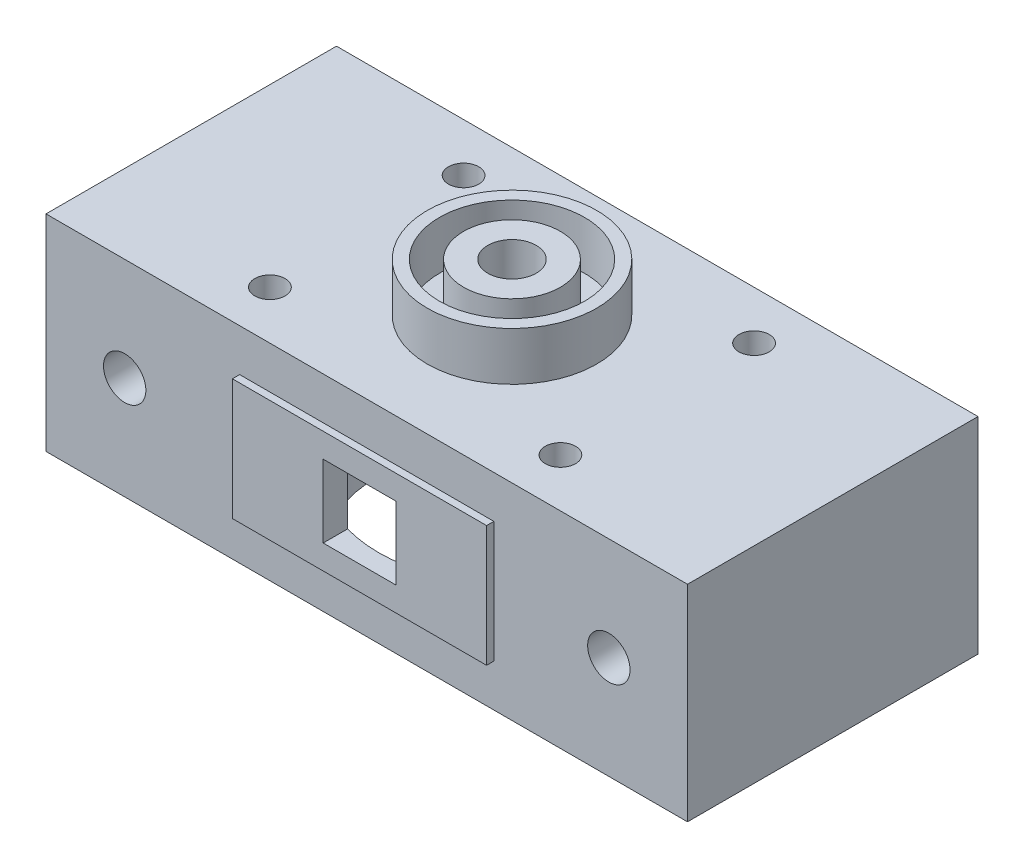
ISO-10303-21;
HEADER;
FILE_DESCRIPTION(('STEP AP214'),'2;1');
FILE_NAME('part.step','',(''),(''),'','','');
FILE_SCHEMA(('AUTOMOTIVE_DESIGN { 1 0 10303 214 1 1 1 1 }'));
ENDSEC;
DATA;
#1=APPLICATION_CONTEXT('core data for automotive mechanical design processes');
#2=APPLICATION_PROTOCOL_DEFINITION('international standard','automotive_design',2000,#1);
#3=PRODUCT_CONTEXT('',#1,'mechanical');
#4=PRODUCT('Part','Part','',(#3));
#5=PRODUCT_RELATED_PRODUCT_CATEGORY('part','',(#4));
#6=PRODUCT_DEFINITION_FORMATION('','',#4);
#7=PRODUCT_DEFINITION_CONTEXT('part definition',#1,'design');
#8=PRODUCT_DEFINITION('design','',#6,#7);
#9=PRODUCT_DEFINITION_SHAPE('','',#8);
#10=(LENGTH_UNIT() NAMED_UNIT(*) SI_UNIT(.MILLI.,.METRE.));
#11=(NAMED_UNIT(*) PLANE_ANGLE_UNIT() SI_UNIT($,.RADIAN.));
#12=(NAMED_UNIT(*) SI_UNIT($,.STERADIAN.) SOLID_ANGLE_UNIT());
#13=UNCERTAINTY_MEASURE_WITH_UNIT(LENGTH_MEASURE(1.E-05),#10,'distance_accuracy_value','');
#14=(GEOMETRIC_REPRESENTATION_CONTEXT(3) GLOBAL_UNCERTAINTY_ASSIGNED_CONTEXT((#13)) GLOBAL_UNIT_ASSIGNED_CONTEXT((#10,
#11,#12)) REPRESENTATION_CONTEXT('',''));
#15=CARTESIAN_POINT('',(0.,0.,0.));
#16=DIRECTION('',(0.,0.,1.));
#17=DIRECTION('',(1.,0.,0.));
#18=AXIS2_PLACEMENT_3D('',#15,#16,#17);
#19=CARTESIAN_POINT('',(26.5,0.,-12.));
#20=DIRECTION('',(0.,1.,0.));
#21=DIRECTION('',(0.,0.,1.));
#22=AXIS2_PLACEMENT_3D('',#19,#20,#21);
#23=PLANE('',#22);
#24=CARTESIAN_POINT('',(0.,0.,0.));
#25=DIRECTION('',(0.,1.,0.));
#26=DIRECTION('',(0.,0.,1.));
#27=AXIS2_PLACEMENT_3D('',#24,#25,#26);
#28=CIRCLE('',#27,4.);
#29=CARTESIAN_POINT('',(0.,0.,4.));
#30=VERTEX_POINT('',#29);
#31=EDGE_CURVE('E228',#30,#30,#28,.T.);
#32=ORIENTED_EDGE('',*,*,#31,.F.);
#33=EDGE_LOOP('',(#32));
#34=FACE_BOUND('',#33,.T.);
#35=CARTESIAN_POINT('',(0.,0.,0.));
#36=DIRECTION('',(0.,1.,0.));
#37=DIRECTION('',(0.,0.,1.));
#38=AXIS2_PLACEMENT_3D('',#35,#36,#37);
#39=CIRCLE('',#38,6.);
#40=CARTESIAN_POINT('',(0.,0.,6.));
#41=VERTEX_POINT('',#40);
#42=EDGE_CURVE('E12',#41,#41,#39,.F.);
#43=ORIENTED_EDGE('',*,*,#42,.F.);
#44=EDGE_LOOP('',(#43));
#45=FACE_BOUND('',#44,.T.);
#46=ADVANCED_FACE('F46',(#34,#45),#23,.T.);
#47=CARTESIAN_POINT('',(-3.00000000000078,-5.49999999999998,-10.8));
#48=DIRECTION('',(-1.,0.,0.));
#49=DIRECTION('',(0.,-1.,0.));
#50=AXIS2_PLACEMENT_3D('',#47,#48,#49);
#51=PLANE('',#50);
#52=DIRECTION('',(0.,0.,-1.));
#53=VECTOR('',#52,1.);
#54=CARTESIAN_POINT('',(-3.00000000000078,-5.49999999999998,-10.8));
#55=LINE('',#54,#53);
#56=CARTESIAN_POINT('',(-3.00000000000079,-5.49999999999998,-10.5830052442581));
#57=VERTEX_POINT('',#56);
#58=CARTESIAN_POINT('',(-3.00000000000078,-5.49999999999998,-12.6));
#59=VERTEX_POINT('',#58);
#60=EDGE_CURVE('E69',#57,#59,#55,.T.);
#61=ORIENTED_EDGE('',*,*,#60,.F.);
#62=DIRECTION('',(0.,1.,0.));
#63=VECTOR('',#62,1.);
#64=CARTESIAN_POINT('',(-3.00000000000079,-48.1126983722081,-10.5830052442581));
#65=LINE('',#64,#63);
#66=CARTESIAN_POINT('',(-3.00000000000078,-11.5,-10.5830052442581));
#67=VERTEX_POINT('',#66);
#68=EDGE_CURVE('E397',#57,#67,#65,.F.);
#69=ORIENTED_EDGE('',*,*,#68,.T.);
#70=DIRECTION('',(0.,0.,-1.));
#71=VECTOR('',#70,1.);
#72=CARTESIAN_POINT('',(-3.00000000000078,-11.5,-10.8));
#73=LINE('',#72,#71);
#74=CARTESIAN_POINT('',(-3.00000000000078,-11.5,-12.6));
#75=VERTEX_POINT('',#74);
#76=EDGE_CURVE('E347',#67,#75,#73,.T.);
#77=ORIENTED_EDGE('',*,*,#76,.T.);
#78=DIRECTION('',(0.,1.,0.));
#79=VECTOR('',#78,1.);
#80=CARTESIAN_POINT('',(-3.00000000000078,-11.5,-12.6));
#81=LINE('',#80,#79);
#82=EDGE_CURVE('E313',#75,#59,#81,.T.);
#83=ORIENTED_EDGE('',*,*,#82,.T.);
#84=EDGE_LOOP('',(#61,#69,#77,#83));
#85=FACE_BOUND('',#84,.T.);
#86=ADVANCED_FACE('F443',(#85),#51,.F.);
#87=CARTESIAN_POINT('',(2.99999999999922,-11.5,-10.8));
#88=DIRECTION('',(0.,-1.,0.));
#89=DIRECTION('',(0.,0.,-1.));
#90=AXIS2_PLACEMENT_3D('',#87,#88,#89);
#91=PLANE('',#90);
#92=ORIENTED_EDGE('',*,*,#76,.F.);
#93=CARTESIAN_POINT('',(0.,-11.5,0.));
#94=DIRECTION('',(0.,-1.,0.));
#95=DIRECTION('',(0.,0.,-1.));
#96=AXIS2_PLACEMENT_3D('',#93,#94,#95);
#97=CIRCLE('',#96,11.);
#98=CARTESIAN_POINT('',(2.99999999999922,-11.5,-10.5830052442586));
#99=VERTEX_POINT('',#98);
#100=EDGE_CURVE('E400',#67,#99,#97,.T.);
#101=ORIENTED_EDGE('',*,*,#100,.T.);
#102=DIRECTION('',(0.,0.,-1.));
#103=VECTOR('',#102,1.);
#104=CARTESIAN_POINT('',(2.99999999999922,-11.5,-10.8));
#105=LINE('',#104,#103);
#106=CARTESIAN_POINT('',(2.99999999999922,-11.5,-12.6));
#107=VERTEX_POINT('',#106);
#108=EDGE_CURVE('E350',#99,#107,#105,.T.);
#109=ORIENTED_EDGE('',*,*,#108,.T.);
#110=DIRECTION('',(-1.,0.,0.));
#111=VECTOR('',#110,1.);
#112=CARTESIAN_POINT('',(2.99999999999922,-11.5,-12.6));
#113=LINE('',#112,#111);
#114=EDGE_CURVE('E310',#107,#75,#113,.T.);
#115=ORIENTED_EDGE('',*,*,#114,.T.);
#116=EDGE_LOOP('',(#92,#101,#109,#115));
#117=FACE_BOUND('',#116,.T.);
#118=ADVANCED_FACE('F448',(#117),#91,.F.);
#119=CARTESIAN_POINT('',(2.99999999999922,-5.49999999999998,-10.8));
#120=DIRECTION('',(1.,0.,0.));
#121=DIRECTION('',(0.,0.,-1.));
#122=AXIS2_PLACEMENT_3D('',#119,#120,#121);
#123=PLANE('',#122);
#124=ORIENTED_EDGE('',*,*,#108,.F.);
#125=DIRECTION('',(0.,1.,0.));
#126=VECTOR('',#125,1.);
#127=CARTESIAN_POINT('',(2.99999999999922,-48.1126983722081,-10.5830052442586));
#128=LINE('',#127,#126);
#129=CARTESIAN_POINT('',(2.99999999999922,-5.49999999999998,-10.5830052442586));
#130=VERTEX_POINT('',#129);
#131=EDGE_CURVE('E403',#99,#130,#128,.T.);
#132=ORIENTED_EDGE('',*,*,#131,.T.);
#133=DIRECTION('',(0.,0.,-1.));
#134=VECTOR('',#133,1.);
#135=CARTESIAN_POINT('',(2.99999999999922,-5.49999999999998,-10.8));
#136=LINE('',#135,#134);
#137=CARTESIAN_POINT('',(2.99999999999922,-5.49999999999998,-12.6));
#138=VERTEX_POINT('',#137);
#139=EDGE_CURVE('E352',#130,#138,#136,.T.);
#140=ORIENTED_EDGE('',*,*,#139,.T.);
#141=DIRECTION('',(0.,-1.,0.));
#142=VECTOR('',#141,1.);
#143=CARTESIAN_POINT('',(2.99999999999922,-5.49999999999998,-12.6));
#144=LINE('',#143,#142);
#145=EDGE_CURVE('E302',#138,#107,#144,.T.);
#146=ORIENTED_EDGE('',*,*,#145,.T.);
#147=EDGE_LOOP('',(#124,#132,#140,#146));
#148=FACE_BOUND('',#147,.T.);
#149=ADVANCED_FACE('F517',(#148),#123,.F.);
#150=CARTESIAN_POINT('',(2.99999999999922,-5.49999999999998,-10.8));
#151=DIRECTION('',(0.,1.,0.));
#152=DIRECTION('',(0.,0.,1.));
#153=AXIS2_PLACEMENT_3D('',#150,#151,#152);
#154=PLANE('',#153);
#155=ORIENTED_EDGE('',*,*,#139,.F.);
#156=CARTESIAN_POINT('',(0.,-5.49999999999998,0.));
#157=DIRECTION('',(0.,1.,0.));
#158=DIRECTION('',(0.,0.,1.));
#159=AXIS2_PLACEMENT_3D('',#156,#157,#158);
#160=CIRCLE('',#159,11.);
#161=EDGE_CURVE('E407',#130,#57,#160,.T.);
#162=ORIENTED_EDGE('',*,*,#161,.T.);
#163=ORIENTED_EDGE('',*,*,#60,.T.);
#164=DIRECTION('',(1.,0.,0.));
#165=VECTOR('',#164,1.);
#166=CARTESIAN_POINT('',(-3.00000000000078,-5.49999999999998,-12.6));
#167=LINE('',#166,#165);
#168=EDGE_CURVE('E315',#59,#138,#167,.T.);
#169=ORIENTED_EDGE('',*,*,#168,.T.);
#170=EDGE_LOOP('',(#155,#162,#163,#169));
#171=FACE_BOUND('',#170,.T.);
#172=ADVANCED_FACE('F514',(#171),#154,.F.);
#173=CARTESIAN_POINT('',(-3.00000000000078,-5.49999999999998,10.8));
#174=DIRECTION('',(1.,0.,0.));
#175=DIRECTION('',(0.,1.,0.));
#176=AXIS2_PLACEMENT_3D('',#173,#174,#175);
#177=PLANE('',#176);
#178=DIRECTION('',(0.,0.,1.));
#179=VECTOR('',#178,1.);
#180=CARTESIAN_POINT('',(-3.00000000000078,-11.5,10.8));
#181=LINE('',#180,#179);
#182=CARTESIAN_POINT('',(-3.00000000000079,-11.5,10.5830052442581));
#183=VERTEX_POINT('',#182);
#184=CARTESIAN_POINT('',(-3.00000000000078,-11.5,12.6));
#185=VERTEX_POINT('',#184);
#186=EDGE_CURVE('E61',#183,#185,#181,.T.);
#187=ORIENTED_EDGE('',*,*,#186,.F.);
#188=DIRECTION('',(0.,1.,0.));
#189=VECTOR('',#188,1.);
#190=CARTESIAN_POINT('',(-3.00000000000079,-48.1126983722081,10.5830052442581));
#191=LINE('',#190,#189);
#192=CARTESIAN_POINT('',(-3.00000000000078,-5.49999999999998,10.5830052442581));
#193=VERTEX_POINT('',#192);
#194=EDGE_CURVE('E409',#183,#193,#191,.T.);
#195=ORIENTED_EDGE('',*,*,#194,.T.);
#196=DIRECTION('',(0.,0.,1.));
#197=VECTOR('',#196,1.);
#198=CARTESIAN_POINT('',(-3.00000000000078,-5.49999999999998,10.8));
#199=LINE('',#198,#197);
#200=CARTESIAN_POINT('',(-3.00000000000078,-5.49999999999998,12.6));
#201=VERTEX_POINT('',#200);
#202=EDGE_CURVE('E300',#193,#201,#199,.T.);
#203=ORIENTED_EDGE('',*,*,#202,.T.);
#204=DIRECTION('',(0.,1.,0.));
#205=VECTOR('',#204,1.);
#206=CARTESIAN_POINT('',(-3.00000000000078,-11.5,12.6));
#207=LINE('',#206,#205);
#208=EDGE_CURVE('E261',#185,#201,#207,.T.);
#209=ORIENTED_EDGE('',*,*,#208,.F.);
#210=EDGE_LOOP('',(#187,#195,#203,#209));
#211=FACE_BOUND('',#210,.T.);
#212=ADVANCED_FACE('F424',(#211),#177,.T.);
#213=CARTESIAN_POINT('',(2.99999999999922,-5.49999999999998,10.8));
#214=DIRECTION('',(0.,-1.,0.));
#215=DIRECTION('',(0.,0.,-1.));
#216=AXIS2_PLACEMENT_3D('',#213,#214,#215);
#217=PLANE('',#216);
#218=ORIENTED_EDGE('',*,*,#202,.F.);
#219=CARTESIAN_POINT('',(2.99999999999922,-5.49999999999998,10.5830052442586));
#220=VERTEX_POINT('',#219);
#221=EDGE_CURVE('E54',#193,#220,#160,.T.);
#222=ORIENTED_EDGE('',*,*,#221,.T.);
#223=DIRECTION('',(0.,0.,1.));
#224=VECTOR('',#223,1.);
#225=CARTESIAN_POINT('',(2.99999999999922,-5.49999999999998,10.8));
#226=LINE('',#225,#224);
#227=CARTESIAN_POINT('',(2.99999999999922,-5.49999999999998,12.6));
#228=VERTEX_POINT('',#227);
#229=EDGE_CURVE('E303',#220,#228,#226,.T.);
#230=ORIENTED_EDGE('',*,*,#229,.T.);
#231=DIRECTION('',(1.,0.,0.));
#232=VECTOR('',#231,1.);
#233=CARTESIAN_POINT('',(-3.00000000000078,-5.49999999999998,12.6));
#234=LINE('',#233,#232);
#235=EDGE_CURVE('E258',#201,#228,#234,.T.);
#236=ORIENTED_EDGE('',*,*,#235,.F.);
#237=EDGE_LOOP('',(#218,#222,#230,#236));
#238=FACE_BOUND('',#237,.T.);
#239=ADVANCED_FACE('F427',(#238),#217,.T.);
#240=CARTESIAN_POINT('',(2.99999999999922,-5.49999999999998,10.8));
#241=DIRECTION('',(-1.,0.,0.));
#242=DIRECTION('',(0.,0.,1.));
#243=AXIS2_PLACEMENT_3D('',#240,#241,#242);
#244=PLANE('',#243);
#245=ORIENTED_EDGE('',*,*,#229,.F.);
#246=DIRECTION('',(0.,1.,0.));
#247=VECTOR('',#246,1.);
#248=CARTESIAN_POINT('',(2.99999999999922,-48.1126983722081,10.5830052442586));
#249=LINE('',#248,#247);
#250=CARTESIAN_POINT('',(2.99999999999922,-11.5,10.5830052442586));
#251=VERTEX_POINT('',#250);
#252=EDGE_CURVE('E410',#220,#251,#249,.F.);
#253=ORIENTED_EDGE('',*,*,#252,.T.);
#254=DIRECTION('',(0.,0.,1.));
#255=VECTOR('',#254,1.);
#256=CARTESIAN_POINT('',(2.99999999999922,-11.5,10.8));
#257=LINE('',#256,#255);
#258=CARTESIAN_POINT('',(2.99999999999922,-11.5,12.6));
#259=VERTEX_POINT('',#258);
#260=EDGE_CURVE('E305',#251,#259,#257,.T.);
#261=ORIENTED_EDGE('',*,*,#260,.T.);
#262=DIRECTION('',(0.,-1.,0.));
#263=VECTOR('',#262,1.);
#264=CARTESIAN_POINT('',(2.99999999999922,-5.49999999999998,12.6));
#265=LINE('',#264,#263);
#266=EDGE_CURVE('E255',#228,#259,#265,.T.);
#267=ORIENTED_EDGE('',*,*,#266,.F.);
#268=EDGE_LOOP('',(#245,#253,#261,#267));
#269=FACE_BOUND('',#268,.T.);
#270=ADVANCED_FACE('F432',(#269),#244,.T.);
#271=CARTESIAN_POINT('',(2.99999999999922,-11.5,10.8));
#272=DIRECTION('',(0.,1.,0.));
#273=DIRECTION('',(0.,0.,1.));
#274=AXIS2_PLACEMENT_3D('',#271,#272,#273);
#275=PLANE('',#274);
#276=ORIENTED_EDGE('',*,*,#260,.F.);
#277=EDGE_CURVE('E404',#251,#183,#97,.T.);
#278=ORIENTED_EDGE('',*,*,#277,.T.);
#279=ORIENTED_EDGE('',*,*,#186,.T.);
#280=DIRECTION('',(-1.,0.,0.));
#281=VECTOR('',#280,1.);
#282=CARTESIAN_POINT('',(2.99999999999922,-11.5,12.6));
#283=LINE('',#282,#281);
#284=EDGE_CURVE('E264',#259,#185,#283,.T.);
#285=ORIENTED_EDGE('',*,*,#284,.F.);
#286=EDGE_LOOP('',(#276,#278,#279,#285));
#287=FACE_BOUND('',#286,.T.);
#288=ADVANCED_FACE('F418',(#287),#275,.T.);
#289=CARTESIAN_POINT('',(0.,0.,-12.));
#290=DIRECTION('',(0.,0.,-1.));
#291=DIRECTION('',(-1.,0.,0.));
#292=AXIS2_PLACEMENT_3D('',#289,#290,#291);
#293=PLANE('',#292);
#294=CARTESIAN_POINT('',(-20.,-8.5,-12.));
#295=DIRECTION('',(0.,0.,-1.));
#296=DIRECTION('',(-1.,0.,0.));
#297=AXIS2_PLACEMENT_3D('',#294,#295,#296);
#298=CIRCLE('',#297,1.75);
#299=CARTESIAN_POINT('',(-21.75,-8.5,-12.));
#300=VERTEX_POINT('',#299);
#301=EDGE_CURVE('E360',#300,#300,#298,.T.);
#302=ORIENTED_EDGE('',*,*,#301,.F.);
#303=EDGE_LOOP('',(#302));
#304=FACE_BOUND('',#303,.T.);
#305=CARTESIAN_POINT('',(20.,-8.5,-12.));
#306=DIRECTION('',(0.,0.,1.));
#307=DIRECTION('',(1.,0.,0.));
#308=AXIS2_PLACEMENT_3D('',#305,#306,#307);
#309=CIRCLE('',#308,1.75);
#310=CARTESIAN_POINT('',(21.75,-8.5,-12.));
#311=VERTEX_POINT('',#310);
#312=EDGE_CURVE('E383',#311,#311,#309,.T.);
#313=ORIENTED_EDGE('',*,*,#312,.T.);
#314=EDGE_LOOP('',(#313));
#315=FACE_BOUND('',#314,.T.);
#316=DIRECTION('',(1.,0.,0.));
#317=VECTOR('',#316,1.);
#318=CARTESIAN_POINT('',(26.5,-17.,-12.));
#319=LINE('',#318,#317);
#320=CARTESIAN_POINT('',(-26.5,-17.,-12.));
#321=VERTEX_POINT('',#320);
#322=CARTESIAN_POINT('',(26.5,-17.,-12.));
#323=VERTEX_POINT('',#322);
#324=EDGE_CURVE('E388',#321,#323,#319,.T.);
#325=ORIENTED_EDGE('',*,*,#324,.F.);
#326=DIRECTION('',(0.,1.,0.));
#327=VECTOR('',#326,1.);
#328=CARTESIAN_POINT('',(-26.5,0.,-12.));
#329=LINE('',#328,#327);
#330=CARTESIAN_POINT('',(-26.5,0.,-12.));
#331=VERTEX_POINT('',#330);
#332=EDGE_CURVE('E363',#321,#331,#329,.T.);
#333=ORIENTED_EDGE('',*,*,#332,.T.);
#334=DIRECTION('',(-1.,0.,0.));
#335=VECTOR('',#334,1.);
#336=CARTESIAN_POINT('',(26.5,0.,-12.));
#337=LINE('',#336,#335);
#338=CARTESIAN_POINT('',(26.5,0.,-12.));
#339=VERTEX_POINT('',#338);
#340=EDGE_CURVE('E386',#339,#331,#337,.T.);
#341=ORIENTED_EDGE('',*,*,#340,.F.);
#342=DIRECTION('',(0.,1.,0.));
#343=VECTOR('',#342,1.);
#344=CARTESIAN_POINT('',(26.5,0.,-12.));
#345=LINE('',#344,#343);
#346=EDGE_CURVE('E391',#323,#339,#345,.T.);
#347=ORIENTED_EDGE('',*,*,#346,.F.);
#348=EDGE_LOOP('',(#325,#333,#341,#347));
#349=FACE_BOUND('',#348,.T.);
#350=DIRECTION('',(1.,0.,0.));
#351=VECTOR('',#350,1.);
#352=CARTESIAN_POINT('',(10.4999999999992,-3.49999999999998,-12.));
#353=LINE('',#352,#351);
#354=CARTESIAN_POINT('',(-10.5000000000008,-3.49999999999998,-12.));
#355=VERTEX_POINT('',#354);
#356=CARTESIAN_POINT('',(10.4999999999992,-3.49999999999998,-12.));
#357=VERTEX_POINT('',#356);
#358=EDGE_CURVE('E332',#355,#357,#353,.T.);
#359=ORIENTED_EDGE('',*,*,#358,.F.);
#360=DIRECTION('',(0.,1.,0.));
#361=VECTOR('',#360,1.);
#362=CARTESIAN_POINT('',(-10.5000000000008,-3.49999999999998,-12.));
#363=LINE('',#362,#361);
#364=CARTESIAN_POINT('',(-10.5000000000008,-13.5,-12.));
#365=VERTEX_POINT('',#364);
#366=EDGE_CURVE('E318',#365,#355,#363,.T.);
#367=ORIENTED_EDGE('',*,*,#366,.F.);
#368=DIRECTION('',(-1.,0.,0.));
#369=VECTOR('',#368,1.);
#370=CARTESIAN_POINT('',(10.4999999999992,-13.5,-12.));
#371=LINE('',#370,#369);
#372=CARTESIAN_POINT('',(10.4999999999992,-13.5,-12.));
#373=VERTEX_POINT('',#372);
#374=EDGE_CURVE('E323',#373,#365,#371,.T.);
#375=ORIENTED_EDGE('',*,*,#374,.F.);
#376=DIRECTION('',(0.,-1.,0.));
#377=VECTOR('',#376,1.);
#378=CARTESIAN_POINT('',(10.4999999999992,-3.49999999999998,-12.));
#379=LINE('',#378,#377);
#380=EDGE_CURVE('E334',#357,#373,#379,.T.);
#381=ORIENTED_EDGE('',*,*,#380,.F.);
#382=EDGE_LOOP('',(#359,#367,#375,#381));
#383=FACE_BOUND('',#382,.T.);
#384=ADVANCED_FACE('F439',(#304,#315,#349,#383),#293,.T.);
#385=CARTESIAN_POINT('',(12.,0.,-8.));
#386=DIRECTION('',(0.,1.,0.));
#387=DIRECTION('',(0.,0.,1.));
#388=AXIS2_PLACEMENT_3D('',#385,#386,#387);
#389=CIRCLE('',#388,1.24999999999999);
#390=CARTESIAN_POINT('',(12.,0.,-6.75000000000001));
#391=VERTEX_POINT('',#390);
#392=EDGE_CURVE('E206',#391,#391,#389,.T.);
#393=ORIENTED_EDGE('',*,*,#392,.F.);
#394=EDGE_LOOP('',(#393));
#395=FACE_BOUND('',#394,.T.);
#396=CARTESIAN_POINT('',(12.,0.,8.));
#397=DIRECTION('',(0.,1.,0.));
#398=DIRECTION('',(0.,0.,1.));
#399=AXIS2_PLACEMENT_3D('',#396,#397,#398);
#400=CIRCLE('',#399,1.24999999999999);
#401=CARTESIAN_POINT('',(12.,0.,9.24999999999999));
#402=VERTEX_POINT('',#401);
#403=EDGE_CURVE('E205',#402,#402,#400,.T.);
#404=ORIENTED_EDGE('',*,*,#403,.F.);
#405=EDGE_LOOP('',(#404));
#406=FACE_BOUND('',#405,.T.);
#407=CARTESIAN_POINT('',(-12.,0.,8.));
#408=DIRECTION('',(0.,1.,0.));
#409=DIRECTION('',(0.,0.,1.));
#410=AXIS2_PLACEMENT_3D('',#407,#408,#409);
#411=CIRCLE('',#410,1.24999999999999);
#412=CARTESIAN_POINT('',(-12.,0.,9.24999999999999));
#413=VERTEX_POINT('',#412);
#414=EDGE_CURVE('E216',#413,#413,#411,.T.);
#415=ORIENTED_EDGE('',*,*,#414,.F.);
#416=EDGE_LOOP('',(#415));
#417=FACE_BOUND('',#416,.T.);
#418=CARTESIAN_POINT('',(-12.,0.,-8.));
#419=DIRECTION('',(0.,1.,0.));
#420=DIRECTION('',(0.,0.,1.));
#421=AXIS2_PLACEMENT_3D('',#418,#419,#420);
#422=CIRCLE('',#421,1.24999999999999);
#423=CARTESIAN_POINT('',(-12.,0.,-6.75000000000001));
#424=VERTEX_POINT('',#423);
#425=EDGE_CURVE('E222',#424,#424,#422,.T.);
#426=ORIENTED_EDGE('',*,*,#425,.F.);
#427=EDGE_LOOP('',(#426));
#428=FACE_BOUND('',#427,.T.);
#429=CARTESIAN_POINT('',(0.,0.,0.));
#430=DIRECTION('',(0.,1.,0.));
#431=DIRECTION('',(0.,0.,1.));
#432=AXIS2_PLACEMENT_3D('',#429,#430,#431);
#433=CIRCLE('',#432,7.);
#434=CARTESIAN_POINT('',(0.,0.,7.));
#435=VERTEX_POINT('',#434);
#436=EDGE_CURVE('E235',#435,#435,#433,.T.);
#437=ORIENTED_EDGE('',*,*,#436,.F.);
#438=EDGE_LOOP('',(#437));
#439=FACE_BOUND('',#438,.T.);
#440=ORIENTED_EDGE('',*,*,#340,.T.);
#441=DIRECTION('',(0.,0.,1.));
#442=VECTOR('',#441,1.);
#443=CARTESIAN_POINT('',(-26.5,0.,-12.));
#444=LINE('',#443,#442);
#445=CARTESIAN_POINT('',(-26.5,0.,12.));
#446=VERTEX_POINT('',#445);
#447=EDGE_CURVE('E366',#331,#446,#444,.T.);
#448=ORIENTED_EDGE('',*,*,#447,.T.);
#449=DIRECTION('',(-1.,0.,0.));
#450=VECTOR('',#449,1.);
#451=CARTESIAN_POINT('',(26.5,0.,12.));
#452=LINE('',#451,#450);
#453=CARTESIAN_POINT('',(26.5,0.,12.));
#454=VERTEX_POINT('',#453);
#455=EDGE_CURVE('E375',#454,#446,#452,.T.);
#456=ORIENTED_EDGE('',*,*,#455,.F.);
#457=DIRECTION('',(0.,0.,1.));
#458=VECTOR('',#457,1.);
#459=CARTESIAN_POINT('',(26.5,0.,-12.));
#460=LINE('',#459,#458);
#461=EDGE_CURVE('E395',#339,#454,#460,.T.);
#462=ORIENTED_EDGE('',*,*,#461,.F.);
#463=EDGE_LOOP('',(#440,#448,#456,#462));
#464=FACE_BOUND('',#463,.T.);
#465=ADVANCED_FACE('F48',(#395,#406,#417,#428,#439,#464),#23,.T.);
#466=CARTESIAN_POINT('',(26.5,0.,-12.));
#467=DIRECTION('',(1.,0.,0.));
#468=DIRECTION('',(0.,1.,0.));
#469=AXIS2_PLACEMENT_3D('',#466,#467,#468);
#470=PLANE('',#469);
#471=ORIENTED_EDGE('',*,*,#461,.T.);
#472=DIRECTION('',(0.,1.,0.));
#473=VECTOR('',#472,1.);
#474=CARTESIAN_POINT('',(26.5,0.,12.));
#475=LINE('',#474,#473);
#476=CARTESIAN_POINT('',(26.5,-17.,12.));
#477=VERTEX_POINT('',#476);
#478=EDGE_CURVE('E380',#477,#454,#475,.T.);
#479=ORIENTED_EDGE('',*,*,#478,.F.);
#480=DIRECTION('',(0.,0.,1.));
#481=VECTOR('',#480,1.);
#482=CARTESIAN_POINT('',(26.5,-17.,-12.));
#483=LINE('',#482,#481);
#484=EDGE_CURVE('E394',#323,#477,#483,.T.);
#485=ORIENTED_EDGE('',*,*,#484,.F.);
#486=ORIENTED_EDGE('',*,*,#346,.T.);
#487=EDGE_LOOP('',(#471,#479,#485,#486));
#488=FACE_BOUND('',#487,.T.);
#489=ADVANCED_FACE('F453',(#488),#470,.T.);
#490=CARTESIAN_POINT('',(26.5,-17.,-12.));
#491=DIRECTION('',(0.,-1.,0.));
#492=DIRECTION('',(1.,0.,0.));
#493=AXIS2_PLACEMENT_3D('',#490,#491,#492);
#494=PLANE('',#493);
#495=CARTESIAN_POINT('',(0.,-17.,0.));
#496=DIRECTION('',(0.,-1.,0.));
#497=DIRECTION('',(1.,0.,0.));
#498=AXIS2_PLACEMENT_3D('',#495,#496,#497);
#499=CIRCLE('',#498,11.);
#500=CARTESIAN_POINT('',(11.,-17.,0.));
#501=VERTEX_POINT('',#500);
#502=EDGE_CURVE('E249',#501,#501,#499,.T.);
#503=ORIENTED_EDGE('',*,*,#502,.F.);
#504=EDGE_LOOP('',(#503));
#505=FACE_BOUND('',#504,.T.);
#506=DIRECTION('',(1.,0.,0.));
#507=VECTOR('',#506,1.);
#508=CARTESIAN_POINT('',(26.5,-17.,12.));
#509=LINE('',#508,#507);
#510=CARTESIAN_POINT('',(-26.5,-17.,12.));
#511=VERTEX_POINT('',#510);
#512=EDGE_CURVE('E377',#511,#477,#509,.T.);
#513=ORIENTED_EDGE('',*,*,#512,.F.);
#514=DIRECTION('',(0.,0.,1.));
#515=VECTOR('',#514,1.);
#516=CARTESIAN_POINT('',(-26.5,-17.,-12.));
#517=LINE('',#516,#515);
#518=EDGE_CURVE('E367',#321,#511,#517,.T.);
#519=ORIENTED_EDGE('',*,*,#518,.F.);
#520=ORIENTED_EDGE('',*,*,#324,.T.);
#521=ORIENTED_EDGE('',*,*,#484,.T.);
#522=EDGE_LOOP('',(#513,#519,#520,#521));
#523=FACE_BOUND('',#522,.T.);
#524=ADVANCED_FACE('F459',(#505,#523),#494,.T.);
#525=CARTESIAN_POINT('',(20.,-8.5,-12.));
#526=DIRECTION('',(0.,0.,1.));
#527=DIRECTION('',(1.,0.,0.));
#528=AXIS2_PLACEMENT_3D('',#525,#526,#527);
#529=CYLINDRICAL_SURFACE('',#528,1.75);
#530=ORIENTED_EDGE('',*,*,#312,.F.);
#531=EDGE_LOOP('',(#530));
#532=FACE_BOUND('',#531,.T.);
#533=CARTESIAN_POINT('',(20.,-8.5,12.));
#534=DIRECTION('',(0.,0.,1.));
#535=DIRECTION('',(1.,0.,0.));
#536=AXIS2_PLACEMENT_3D('',#533,#534,#535);
#537=CIRCLE('',#536,1.75);
#538=CARTESIAN_POINT('',(21.75,-8.5,12.));
#539=VERTEX_POINT('',#538);
#540=EDGE_CURVE('E370',#539,#539,#537,.T.);
#541=ORIENTED_EDGE('',*,*,#540,.T.);
#542=EDGE_LOOP('',(#541));
#543=FACE_BOUND('',#542,.T.);
#544=ADVANCED_FACE('F491',(#532,#543),#529,.F.);
#545=CARTESIAN_POINT('',(0.,0.,12.));
#546=DIRECTION('',(0.,0.,-1.));
#547=DIRECTION('',(-1.,0.,0.));
#548=AXIS2_PLACEMENT_3D('',#545,#546,#547);
#549=PLANE('',#548);
#550=DIRECTION('',(-1.,0.,0.));
#551=VECTOR('',#550,1.);
#552=CARTESIAN_POINT('',(10.4999999999992,-13.5,12.));
#553=LINE('',#552,#551);
#554=CARTESIAN_POINT('',(10.4999999999992,-13.5,12.));
#555=VERTEX_POINT('',#554);
#556=CARTESIAN_POINT('',(-10.5000000000008,-13.5,12.));
#557=VERTEX_POINT('',#556);
#558=EDGE_CURVE('E284',#555,#557,#553,.T.);
#559=ORIENTED_EDGE('',*,*,#558,.T.);
#560=DIRECTION('',(0.,1.,0.));
#561=VECTOR('',#560,1.);
#562=CARTESIAN_POINT('',(-10.5000000000008,-3.49999999999998,12.));
#563=LINE('',#562,#561);
#564=CARTESIAN_POINT('',(-10.5000000000008,-3.49999999999998,12.));
#565=VERTEX_POINT('',#564);
#566=EDGE_CURVE('E267',#557,#565,#563,.T.);
#567=ORIENTED_EDGE('',*,*,#566,.T.);
#568=DIRECTION('',(1.,0.,0.));
#569=VECTOR('',#568,1.);
#570=CARTESIAN_POINT('',(10.4999999999992,-3.49999999999998,12.));
#571=LINE('',#570,#569);
#572=CARTESIAN_POINT('',(10.4999999999992,-3.49999999999998,12.));
#573=VERTEX_POINT('',#572);
#574=EDGE_CURVE('E272',#565,#573,#571,.T.);
#575=ORIENTED_EDGE('',*,*,#574,.T.);
#576=DIRECTION('',(0.,-1.,0.));
#577=VECTOR('',#576,1.);
#578=CARTESIAN_POINT('',(10.4999999999992,-3.49999999999998,12.));
#579=LINE('',#578,#577);
#580=EDGE_CURVE('E287',#573,#555,#579,.T.);
#581=ORIENTED_EDGE('',*,*,#580,.T.);
#582=EDGE_LOOP('',(#559,#567,#575,#581));
#583=FACE_BOUND('',#582,.T.);
#584=DIRECTION('',(0.,1.,0.));
#585=VECTOR('',#584,1.);
#586=CARTESIAN_POINT('',(-26.5,0.,12.));
#587=LINE('',#586,#585);
#588=EDGE_CURVE('E357',#511,#446,#587,.T.);
#589=ORIENTED_EDGE('',*,*,#588,.F.);
#590=ORIENTED_EDGE('',*,*,#512,.T.);
#591=ORIENTED_EDGE('',*,*,#478,.T.);
#592=ORIENTED_EDGE('',*,*,#455,.T.);
#593=EDGE_LOOP('',(#589,#590,#591,#592));
#594=FACE_BOUND('',#593,.T.);
#595=ORIENTED_EDGE('',*,*,#540,.F.);
#596=EDGE_LOOP('',(#595));
#597=FACE_BOUND('',#596,.T.);
#598=CARTESIAN_POINT('',(-20.,-8.5,12.));
#599=DIRECTION('',(0.,0.,-1.));
#600=DIRECTION('',(-1.,0.,0.));
#601=AXIS2_PLACEMENT_3D('',#598,#599,#600);
#602=CIRCLE('',#601,1.75);
#603=CARTESIAN_POINT('',(-21.75,-8.5,12.));
#604=VERTEX_POINT('',#603);
#605=EDGE_CURVE('E349',#604,#604,#602,.T.);
#606=ORIENTED_EDGE('',*,*,#605,.T.);
#607=EDGE_LOOP('',(#606));
#608=FACE_BOUND('',#607,.T.);
#609=ADVANCED_FACE('F486',(#583,#594,#597,#608),#549,.F.);
#610=CARTESIAN_POINT('',(-26.5,0.,-12.));
#611=DIRECTION('',(1.,0.,0.));
#612=DIRECTION('',(0.,1.,0.));
#613=AXIS2_PLACEMENT_3D('',#610,#611,#612);
#614=PLANE('',#613);
#615=ORIENTED_EDGE('',*,*,#518,.T.);
#616=ORIENTED_EDGE('',*,*,#588,.T.);
#617=ORIENTED_EDGE('',*,*,#447,.F.);
#618=ORIENTED_EDGE('',*,*,#332,.F.);
#619=EDGE_LOOP('',(#615,#616,#617,#618));
#620=FACE_BOUND('',#619,.T.);
#621=ADVANCED_FACE('F483',(#620),#614,.F.);
#622=CARTESIAN_POINT('',(-20.,-8.5,-12.));
#623=DIRECTION('',(0.,0.,1.));
#624=DIRECTION('',(1.,0.,0.));
#625=AXIS2_PLACEMENT_3D('',#622,#623,#624);
#626=CYLINDRICAL_SURFACE('',#625,1.75);
#627=ORIENTED_EDGE('',*,*,#301,.T.);
#628=EDGE_LOOP('',(#627));
#629=FACE_BOUND('',#628,.T.);
#630=ORIENTED_EDGE('',*,*,#605,.F.);
#631=EDGE_LOOP('',(#630));
#632=FACE_BOUND('',#631,.T.);
#633=ADVANCED_FACE('F505',(#629,#632),#626,.F.);
#634=CARTESIAN_POINT('',(0.,-17.,0.));
#635=DIRECTION('',(0.,1.,0.));
#636=DIRECTION('',(0.,0.,1.));
#637=AXIS2_PLACEMENT_3D('',#634,#635,#636);
#638=CYLINDRICAL_SURFACE('',#637,2.);
#639=CARTESIAN_POINT('',(0.,-2.7,0.));
#640=DIRECTION('',(0.,-1.,0.));
#641=DIRECTION('',(0.,0.,-1.));
#642=AXIS2_PLACEMENT_3D('',#639,#640,#641);
#643=CIRCLE('',#642,2.);
#644=CARTESIAN_POINT('',(0.,-2.7,-2.));
#645=VERTEX_POINT('',#644);
#646=EDGE_CURVE('E252',#645,#645,#643,.F.);
#647=ORIENTED_EDGE('',*,*,#646,.F.);
#648=EDGE_LOOP('',(#647));
#649=FACE_BOUND('',#648,.T.);
#650=CARTESIAN_POINT('',(0.,4.,0.));
#651=DIRECTION('',(0.,1.,0.));
#652=DIRECTION('',(0.,0.,1.));
#653=AXIS2_PLACEMENT_3D('',#650,#651,#652);
#654=CIRCLE('',#653,2.);
#655=CARTESIAN_POINT('',(0.,4.,2.));
#656=VERTEX_POINT('',#655);
#657=EDGE_CURVE('E229',#656,#656,#654,.F.);
#658=ORIENTED_EDGE('',*,*,#657,.F.);
#659=EDGE_LOOP('',(#658));
#660=FACE_BOUND('',#659,.T.);
#661=ADVANCED_FACE('F508',(#649,#660),#638,.F.);
#662=CARTESIAN_POINT('',(0.,0.,-12.6));
#663=DIRECTION('',(0.,0.,-1.));
#664=DIRECTION('',(-1.,0.,0.));
#665=AXIS2_PLACEMENT_3D('',#662,#663,#664);
#666=PLANE('',#665);
#667=DIRECTION('',(0.,1.,0.));
#668=VECTOR('',#667,1.);
#669=CARTESIAN_POINT('',(-10.5000000000008,-3.49999999999998,-12.6));
#670=LINE('',#669,#668);
#671=CARTESIAN_POINT('',(-10.5000000000008,-13.5,-12.6));
#672=VERTEX_POINT('',#671);
#673=CARTESIAN_POINT('',(-10.5000000000008,-3.49999999999998,-12.6));
#674=VERTEX_POINT('',#673);
#675=EDGE_CURVE('E319',#672,#674,#670,.T.);
#676=ORIENTED_EDGE('',*,*,#675,.T.);
#677=DIRECTION('',(1.,0.,0.));
#678=VECTOR('',#677,1.);
#679=CARTESIAN_POINT('',(10.4999999999992,-3.49999999999998,-12.6));
#680=LINE('',#679,#678);
#681=CARTESIAN_POINT('',(10.4999999999992,-3.49999999999998,-12.6));
#682=VERTEX_POINT('',#681);
#683=EDGE_CURVE('E322',#674,#682,#680,.T.);
#684=ORIENTED_EDGE('',*,*,#683,.T.);
#685=DIRECTION('',(0.,-1.,0.));
#686=VECTOR('',#685,1.);
#687=CARTESIAN_POINT('',(10.4999999999992,-3.49999999999998,-12.6));
#688=LINE('',#687,#686);
#689=CARTESIAN_POINT('',(10.4999999999992,-13.5,-12.6));
#690=VERTEX_POINT('',#689);
#691=EDGE_CURVE('E325',#682,#690,#688,.T.);
#692=ORIENTED_EDGE('',*,*,#691,.T.);
#693=DIRECTION('',(-1.,0.,0.));
#694=VECTOR('',#693,1.);
#695=CARTESIAN_POINT('',(10.4999999999992,-13.5,-12.6));
#696=LINE('',#695,#694);
#697=EDGE_CURVE('E327',#690,#672,#696,.T.);
#698=ORIENTED_EDGE('',*,*,#697,.T.);
#699=EDGE_LOOP('',(#676,#684,#692,#698));
#700=FACE_BOUND('',#699,.T.);
#701=ORIENTED_EDGE('',*,*,#114,.F.);
#702=ORIENTED_EDGE('',*,*,#145,.F.);
#703=ORIENTED_EDGE('',*,*,#168,.F.);
#704=ORIENTED_EDGE('',*,*,#82,.F.);
#705=EDGE_LOOP('',(#701,#702,#703,#704));
#706=FACE_BOUND('',#705,.T.);
#707=ADVANCED_FACE('F511',(#700,#706),#666,.T.);
#708=CARTESIAN_POINT('',(-10.5000000000008,-3.49999999999998,-12.6));
#709=DIRECTION('',(1.,0.,0.));
#710=DIRECTION('',(0.,0.,-1.));
#711=AXIS2_PLACEMENT_3D('',#708,#709,#710);
#712=PLANE('',#711);
#713=ORIENTED_EDGE('',*,*,#366,.T.);
#714=DIRECTION('',(0.,0.,1.));
#715=VECTOR('',#714,1.);
#716=CARTESIAN_POINT('',(-10.5000000000008,-3.49999999999998,-12.6));
#717=LINE('',#716,#715);
#718=EDGE_CURVE('E345',#674,#355,#717,.T.);
#719=ORIENTED_EDGE('',*,*,#718,.F.);
#720=ORIENTED_EDGE('',*,*,#675,.F.);
#721=DIRECTION('',(0.,0.,1.));
#722=VECTOR('',#721,1.);
#723=CARTESIAN_POINT('',(-10.5000000000008,-13.5,-12.6));
#724=LINE('',#723,#722);
#725=EDGE_CURVE('E329',#672,#365,#724,.T.);
#726=ORIENTED_EDGE('',*,*,#725,.T.);
#727=EDGE_LOOP('',(#713,#719,#720,#726));
#728=FACE_BOUND('',#727,.T.);
#729=ADVANCED_FACE('F525',(#728),#712,.F.);
#730=CARTESIAN_POINT('',(10.4999999999992,-3.49999999999998,-12.6));
#731=DIRECTION('',(0.,-1.,0.));
#732=DIRECTION('',(0.,0.,-1.));
#733=AXIS2_PLACEMENT_3D('',#730,#731,#732);
#734=PLANE('',#733);
#735=ORIENTED_EDGE('',*,*,#358,.T.);
#736=DIRECTION('',(0.,0.,1.));
#737=VECTOR('',#736,1.);
#738=CARTESIAN_POINT('',(10.4999999999992,-3.49999999999998,-12.6));
#739=LINE('',#738,#737);
#740=EDGE_CURVE('E342',#682,#357,#739,.T.);
#741=ORIENTED_EDGE('',*,*,#740,.F.);
#742=ORIENTED_EDGE('',*,*,#683,.F.);
#743=ORIENTED_EDGE('',*,*,#718,.T.);
#744=EDGE_LOOP('',(#735,#741,#742,#743));
#745=FACE_BOUND('',#744,.T.);
#746=ADVANCED_FACE('F528',(#745),#734,.F.);
#747=CARTESIAN_POINT('',(10.4999999999992,-3.49999999999998,-12.6));
#748=DIRECTION('',(-1.,0.,0.));
#749=DIRECTION('',(0.,-1.,0.));
#750=AXIS2_PLACEMENT_3D('',#747,#748,#749);
#751=PLANE('',#750);
#752=ORIENTED_EDGE('',*,*,#380,.T.);
#753=DIRECTION('',(0.,0.,1.));
#754=VECTOR('',#753,1.);
#755=CARTESIAN_POINT('',(10.4999999999992,-13.5,-12.6));
#756=LINE('',#755,#754);
#757=EDGE_CURVE('E340',#690,#373,#756,.T.);
#758=ORIENTED_EDGE('',*,*,#757,.F.);
#759=ORIENTED_EDGE('',*,*,#691,.F.);
#760=ORIENTED_EDGE('',*,*,#740,.T.);
#761=EDGE_LOOP('',(#752,#758,#759,#760));
#762=FACE_BOUND('',#761,.T.);
#763=ADVANCED_FACE('F532',(#762),#751,.F.);
#764=CARTESIAN_POINT('',(10.4999999999992,-13.5,-12.6));
#765=DIRECTION('',(0.,1.,0.));
#766=DIRECTION('',(0.,0.,1.));
#767=AXIS2_PLACEMENT_3D('',#764,#765,#766);
#768=PLANE('',#767);
#769=ORIENTED_EDGE('',*,*,#374,.T.);
#770=ORIENTED_EDGE('',*,*,#725,.F.);
#771=ORIENTED_EDGE('',*,*,#697,.F.);
#772=ORIENTED_EDGE('',*,*,#757,.T.);
#773=EDGE_LOOP('',(#769,#770,#771,#772));
#774=FACE_BOUND('',#773,.T.);
#775=ADVANCED_FACE('F536',(#774),#768,.F.);
#776=CARTESIAN_POINT('',(-10.5000000000008,-3.49999999999998,12.6));
#777=DIRECTION('',(-1.,0.,0.));
#778=DIRECTION('',(0.,0.,1.));
#779=AXIS2_PLACEMENT_3D('',#776,#777,#778);
#780=PLANE('',#779);
#781=ORIENTED_EDGE('',*,*,#566,.F.);
#782=DIRECTION('',(0.,0.,-1.));
#783=VECTOR('',#782,1.);
#784=CARTESIAN_POINT('',(-10.5000000000008,-13.5,12.6));
#785=LINE('',#784,#783);
#786=CARTESIAN_POINT('',(-10.5000000000008,-13.5,12.6));
#787=VERTEX_POINT('',#786);
#788=EDGE_CURVE('E298',#787,#557,#785,.T.);
#789=ORIENTED_EDGE('',*,*,#788,.F.);
#790=DIRECTION('',(0.,1.,0.));
#791=VECTOR('',#790,1.);
#792=CARTESIAN_POINT('',(-10.5000000000008,-3.49999999999998,12.6));
#793=LINE('',#792,#791);
#794=CARTESIAN_POINT('',(-10.5000000000008,-3.49999999999998,12.6));
#795=VERTEX_POINT('',#794);
#796=EDGE_CURVE('E268',#787,#795,#793,.T.);
#797=ORIENTED_EDGE('',*,*,#796,.T.);
#798=DIRECTION('',(0.,0.,-1.));
#799=VECTOR('',#798,1.);
#800=CARTESIAN_POINT('',(-10.5000000000008,-3.49999999999998,12.6));
#801=LINE('',#800,#799);
#802=EDGE_CURVE('E281',#795,#565,#801,.T.);
#803=ORIENTED_EDGE('',*,*,#802,.T.);
#804=EDGE_LOOP('',(#781,#789,#797,#803));
#805=FACE_BOUND('',#804,.T.);
#806=ADVANCED_FACE('F540',(#805),#780,.T.);
#807=CARTESIAN_POINT('',(10.4999999999992,-13.5,12.6));
#808=DIRECTION('',(0.,-1.,0.));
#809=DIRECTION('',(0.,0.,-1.));
#810=AXIS2_PLACEMENT_3D('',#807,#808,#809);
#811=PLANE('',#810);
#812=ORIENTED_EDGE('',*,*,#558,.F.);
#813=DIRECTION('',(0.,0.,-1.));
#814=VECTOR('',#813,1.);
#815=CARTESIAN_POINT('',(10.4999999999992,-13.5,12.6));
#816=LINE('',#815,#814);
#817=CARTESIAN_POINT('',(10.4999999999992,-13.5,12.6));
#818=VERTEX_POINT('',#817);
#819=EDGE_CURVE('E296',#818,#555,#816,.T.);
#820=ORIENTED_EDGE('',*,*,#819,.F.);
#821=DIRECTION('',(-1.,0.,0.));
#822=VECTOR('',#821,1.);
#823=CARTESIAN_POINT('',(10.4999999999992,-13.5,12.6));
#824=LINE('',#823,#822);
#825=EDGE_CURVE('E271',#818,#787,#824,.T.);
#826=ORIENTED_EDGE('',*,*,#825,.T.);
#827=ORIENTED_EDGE('',*,*,#788,.T.);
#828=EDGE_LOOP('',(#812,#820,#826,#827));
#829=FACE_BOUND('',#828,.T.);
#830=ADVANCED_FACE('F769',(#829),#811,.T.);
#831=CARTESIAN_POINT('',(10.4999999999992,-3.49999999999998,12.6));
#832=DIRECTION('',(1.,0.,0.));
#833=DIRECTION('',(0.,1.,0.));
#834=AXIS2_PLACEMENT_3D('',#831,#832,#833);
#835=PLANE('',#834);
#836=ORIENTED_EDGE('',*,*,#580,.F.);
#837=DIRECTION('',(0.,0.,-1.));
#838=VECTOR('',#837,1.);
#839=CARTESIAN_POINT('',(10.4999999999992,-3.49999999999998,12.6));
#840=LINE('',#839,#838);
#841=CARTESIAN_POINT('',(10.4999999999992,-3.49999999999998,12.6));
#842=VERTEX_POINT('',#841);
#843=EDGE_CURVE('E293',#842,#573,#840,.T.);
#844=ORIENTED_EDGE('',*,*,#843,.F.);
#845=DIRECTION('',(0.,-1.,0.));
#846=VECTOR('',#845,1.);
#847=CARTESIAN_POINT('',(10.4999999999992,-3.49999999999998,12.6));
#848=LINE('',#847,#846);
#849=EDGE_CURVE('E275',#842,#818,#848,.T.);
#850=ORIENTED_EDGE('',*,*,#849,.T.);
#851=ORIENTED_EDGE('',*,*,#819,.T.);
#852=EDGE_LOOP('',(#836,#844,#850,#851));
#853=FACE_BOUND('',#852,.T.);
#854=ADVANCED_FACE('F765',(#853),#835,.T.);
#855=CARTESIAN_POINT('',(10.4999999999992,-3.49999999999998,12.6));
#856=DIRECTION('',(0.,1.,0.));
#857=DIRECTION('',(0.,0.,1.));
#858=AXIS2_PLACEMENT_3D('',#855,#856,#857);
#859=PLANE('',#858);
#860=ORIENTED_EDGE('',*,*,#574,.F.);
#861=ORIENTED_EDGE('',*,*,#802,.F.);
#862=DIRECTION('',(1.,0.,0.));
#863=VECTOR('',#862,1.);
#864=CARTESIAN_POINT('',(10.4999999999992,-3.49999999999998,12.6));
#865=LINE('',#864,#863);
#866=EDGE_CURVE('E278',#795,#842,#865,.T.);
#867=ORIENTED_EDGE('',*,*,#866,.T.);
#868=ORIENTED_EDGE('',*,*,#843,.T.);
#869=EDGE_LOOP('',(#860,#861,#867,#868));
#870=FACE_BOUND('',#869,.T.);
#871=ADVANCED_FACE('F762',(#870),#859,.T.);
#872=CARTESIAN_POINT('',(0.,0.,12.6));
#873=DIRECTION('',(0.,0.,1.));
#874=DIRECTION('',(-1.,0.,0.));
#875=AXIS2_PLACEMENT_3D('',#872,#873,#874);
#876=PLANE('',#875);
#877=ORIENTED_EDGE('',*,*,#266,.T.);
#878=ORIENTED_EDGE('',*,*,#284,.T.);
#879=ORIENTED_EDGE('',*,*,#208,.T.);
#880=ORIENTED_EDGE('',*,*,#235,.T.);
#881=EDGE_LOOP('',(#877,#878,#879,#880));
#882=FACE_BOUND('',#881,.T.);
#883=ORIENTED_EDGE('',*,*,#796,.F.);
#884=ORIENTED_EDGE('',*,*,#825,.F.);
#885=ORIENTED_EDGE('',*,*,#849,.F.);
#886=ORIENTED_EDGE('',*,*,#866,.F.);
#887=EDGE_LOOP('',(#883,#884,#885,#886));
#888=FACE_BOUND('',#887,.T.);
#889=ADVANCED_FACE('F430',(#882,#888),#876,.T.);
#890=CARTESIAN_POINT('',(0.,-2.7,0.));
#891=DIRECTION('',(0.,-1.,0.));
#892=DIRECTION('',(0.,0.,-1.));
#893=AXIS2_PLACEMENT_3D('',#890,#891,#892);
#894=PLANE('',#893);
#895=CARTESIAN_POINT('',(0.,-2.7,0.));
#896=DIRECTION('',(0.,-1.,0.));
#897=DIRECTION('',(0.,0.,-1.));
#898=AXIS2_PLACEMENT_3D('',#895,#896,#897);
#899=CIRCLE('',#898,11.);
#900=CARTESIAN_POINT('',(0.,-2.7,-11.));
#901=VERTEX_POINT('',#900);
#902=EDGE_CURVE('E244',#901,#901,#899,.T.);
#903=ORIENTED_EDGE('',*,*,#902,.T.);
#904=EDGE_LOOP('',(#903));
#905=FACE_BOUND('',#904,.T.);
#906=ORIENTED_EDGE('',*,*,#646,.T.);
#907=EDGE_LOOP('',(#906));
#908=FACE_BOUND('',#907,.T.);
#909=ADVANCED_FACE('F577',(#905,#908),#894,.T.);
#910=CARTESIAN_POINT('',(0.,-48.1126983722081,0.));
#911=DIRECTION('',(0.,1.,0.));
#912=DIRECTION('',(0.,0.,1.));
#913=AXIS2_PLACEMENT_3D('',#910,#911,#912);
#914=CYLINDRICAL_SURFACE('',#913,11.);
#915=ORIENTED_EDGE('',*,*,#221,.F.);
#916=ORIENTED_EDGE('',*,*,#194,.F.);
#917=ORIENTED_EDGE('',*,*,#277,.F.);
#918=ORIENTED_EDGE('',*,*,#252,.F.);
#919=EDGE_LOOP('',(#915,#916,#917,#918));
#920=FACE_BOUND('',#919,.T.);
#921=ORIENTED_EDGE('',*,*,#161,.F.);
#922=ORIENTED_EDGE('',*,*,#131,.F.);
#923=ORIENTED_EDGE('',*,*,#100,.F.);
#924=ORIENTED_EDGE('',*,*,#68,.F.);
#925=EDGE_LOOP('',(#921,#922,#923,#924));
#926=FACE_BOUND('',#925,.T.);
#927=ORIENTED_EDGE('',*,*,#902,.F.);
#928=EDGE_LOOP('',(#927));
#929=FACE_BOUND('',#928,.T.);
#930=ORIENTED_EDGE('',*,*,#502,.T.);
#931=EDGE_LOOP('',(#930));
#932=FACE_BOUND('',#931,.T.);
#933=ADVANCED_FACE('F422',(#920,#926,#929,#932),#914,.F.);
#934=CARTESIAN_POINT('',(0.,4.,0.));
#935=DIRECTION('',(0.,-1.,0.));
#936=DIRECTION('',(0.,0.,-1.));
#937=AXIS2_PLACEMENT_3D('',#934,#935,#936);
#938=CYLINDRICAL_SURFACE('',#937,6.);
#939=CARTESIAN_POINT('',(0.,4.,0.));
#940=DIRECTION('',(0.,1.,0.));
#941=DIRECTION('',(0.,0.,1.));
#942=AXIS2_PLACEMENT_3D('',#939,#940,#941);
#943=CIRCLE('',#942,6.);
#944=CARTESIAN_POINT('',(0.,4.,6.));
#945=VERTEX_POINT('',#944);
#946=EDGE_CURVE('E238',#945,#945,#943,.T.);
#947=ORIENTED_EDGE('',*,*,#946,.T.);
#948=EDGE_LOOP('',(#947));
#949=FACE_BOUND('',#948,.T.);
#950=ORIENTED_EDGE('',*,*,#42,.T.);
#951=EDGE_LOOP('',(#950));
#952=FACE_BOUND('',#951,.T.);
#953=ADVANCED_FACE('F576',(#949,#952),#938,.F.);
#954=CARTESIAN_POINT('',(0.,4.,0.));
#955=DIRECTION('',(0.,-1.,0.));
#956=DIRECTION('',(0.,0.,-1.));
#957=AXIS2_PLACEMENT_3D('',#954,#955,#956);
#958=CYLINDRICAL_SURFACE('',#957,7.);
#959=CARTESIAN_POINT('',(0.,4.,0.));
#960=DIRECTION('',(0.,1.,0.));
#961=DIRECTION('',(0.,0.,1.));
#962=AXIS2_PLACEMENT_3D('',#959,#960,#961);
#963=CIRCLE('',#962,7.);
#964=CARTESIAN_POINT('',(0.,4.,7.));
#965=VERTEX_POINT('',#964);
#966=EDGE_CURVE('E241',#965,#965,#963,.T.);
#967=ORIENTED_EDGE('',*,*,#966,.F.);
#968=EDGE_LOOP('',(#967));
#969=FACE_BOUND('',#968,.T.);
#970=ORIENTED_EDGE('',*,*,#436,.T.);
#971=EDGE_LOOP('',(#970));
#972=FACE_BOUND('',#971,.T.);
#973=ADVANCED_FACE('F601',(#969,#972),#958,.T.);
#974=CARTESIAN_POINT('',(0.,4.,0.));
#975=DIRECTION('',(0.,1.,0.));
#976=DIRECTION('',(0.,0.,1.));
#977=AXIS2_PLACEMENT_3D('',#974,#975,#976);
#978=PLANE('',#977);
#979=ORIENTED_EDGE('',*,*,#946,.F.);
#980=EDGE_LOOP('',(#979));
#981=FACE_BOUND('',#980,.T.);
#982=ORIENTED_EDGE('',*,*,#966,.T.);
#983=EDGE_LOOP('',(#982));
#984=FACE_BOUND('',#983,.T.);
#985=ADVANCED_FACE('F611',(#981,#984),#978,.T.);
#986=CARTESIAN_POINT('',(0.,4.,0.));
#987=DIRECTION('',(0.,-1.,0.));
#988=DIRECTION('',(0.,0.,-1.));
#989=AXIS2_PLACEMENT_3D('',#986,#987,#988);
#990=CYLINDRICAL_SURFACE('',#989,4.);
#991=CARTESIAN_POINT('',(0.,4.,0.));
#992=DIRECTION('',(0.,1.,0.));
#993=DIRECTION('',(0.,0.,1.));
#994=AXIS2_PLACEMENT_3D('',#991,#992,#993);
#995=CIRCLE('',#994,4.);
#996=CARTESIAN_POINT('',(0.,4.,4.));
#997=VERTEX_POINT('',#996);
#998=EDGE_CURVE('E232',#997,#997,#995,.T.);
#999=ORIENTED_EDGE('',*,*,#998,.F.);
#1000=EDGE_LOOP('',(#999));
#1001=FACE_BOUND('',#1000,.T.);
#1002=ORIENTED_EDGE('',*,*,#31,.T.);
#1003=EDGE_LOOP('',(#1002));
#1004=FACE_BOUND('',#1003,.T.);
#1005=ADVANCED_FACE('F621',(#1001,#1004),#990,.T.);
#1006=CARTESIAN_POINT('',(0.,4.,0.));
#1007=DIRECTION('',(0.,1.,0.));
#1008=DIRECTION('',(0.,0.,1.));
#1009=AXIS2_PLACEMENT_3D('',#1006,#1007,#1008);
#1010=PLANE('',#1009);
#1011=ORIENTED_EDGE('',*,*,#657,.T.);
#1012=EDGE_LOOP('',(#1011));
#1013=FACE_BOUND('',#1012,.T.);
#1014=ORIENTED_EDGE('',*,*,#998,.T.);
#1015=EDGE_LOOP('',(#1014));
#1016=FACE_BOUND('',#1015,.T.);
#1017=ADVANCED_FACE('F631',(#1013,#1016),#1010,.T.);
#1018=CARTESIAN_POINT('',(-12.,-11.5,-8.));
#1019=DIRECTION('',(0.,1.,0.));
#1020=DIRECTION('',(0.,0.,1.));
#1021=AXIS2_PLACEMENT_3D('',#1018,#1019,#1020);
#1022=CONICAL_SURFACE('',#1021,1.25,1.02974425867665);
#1023=CARTESIAN_POINT('',(-12.,-12.2510757737845,-8.));
#1024=VERTEX_POINT('',#1023);
#1025=VERTEX_LOOP('',#1024);
#1026=FACE_BOUND('',#1025,.T.);
#1027=CARTESIAN_POINT('',(-12.,-11.5,-8.));
#1028=DIRECTION('',(0.,1.,0.));
#1029=DIRECTION('',(0.,0.,1.));
#1030=AXIS2_PLACEMENT_3D('',#1027,#1028,#1029);
#1031=CIRCLE('',#1030,1.25);
#1032=CARTESIAN_POINT('',(-12.,-11.5,-6.75));
#1033=VERTEX_POINT('',#1032);
#1034=EDGE_CURVE('E225',#1033,#1033,#1031,.T.);
#1035=ORIENTED_EDGE('',*,*,#1034,.T.);
#1036=EDGE_LOOP('',(#1035));
#1037=FACE_BOUND('',#1036,.T.);
#1038=ADVANCED_FACE('F640',(#1026,#1037),#1022,.F.);
#1039=CARTESIAN_POINT('',(-12.,0.,-8.));
#1040=DIRECTION('',(0.,1.,0.));
#1041=DIRECTION('',(0.,0.,1.));
#1042=AXIS2_PLACEMENT_3D('',#1039,#1040,#1041);
#1043=CYLINDRICAL_SURFACE('',#1042,1.24999999999999);
#1044=ORIENTED_EDGE('',*,*,#1034,.F.);
#1045=EDGE_LOOP('',(#1044));
#1046=FACE_BOUND('',#1045,.T.);
#1047=ORIENTED_EDGE('',*,*,#425,.T.);
#1048=EDGE_LOOP('',(#1047));
#1049=FACE_BOUND('',#1048,.T.);
#1050=ADVANCED_FACE('F658',(#1046,#1049),#1043,.F.);
#1051=CARTESIAN_POINT('',(-12.,-11.5,8.));
#1052=DIRECTION('',(0.,1.,0.));
#1053=DIRECTION('',(0.,0.,1.));
#1054=AXIS2_PLACEMENT_3D('',#1051,#1052,#1053);
#1055=CONICAL_SURFACE('',#1054,1.25,1.02974425867665);
#1056=CARTESIAN_POINT('',(-12.,-12.2510757737845,8.));
#1057=VERTEX_POINT('',#1056);
#1058=VERTEX_LOOP('',#1057);
#1059=FACE_BOUND('',#1058,.T.);
#1060=CARTESIAN_POINT('',(-12.,-11.5,8.));
#1061=DIRECTION('',(0.,1.,0.));
#1062=DIRECTION('',(0.,0.,1.));
#1063=AXIS2_PLACEMENT_3D('',#1060,#1061,#1062);
#1064=CIRCLE('',#1063,1.25);
#1065=CARTESIAN_POINT('',(-12.,-11.5,9.25));
#1066=VERTEX_POINT('',#1065);
#1067=EDGE_CURVE('E219',#1066,#1066,#1064,.T.);
#1068=ORIENTED_EDGE('',*,*,#1067,.T.);
#1069=EDGE_LOOP('',(#1068));
#1070=FACE_BOUND('',#1069,.T.);
#1071=ADVANCED_FACE('F669',(#1059,#1070),#1055,.F.);
#1072=CARTESIAN_POINT('',(-12.,0.,8.));
#1073=DIRECTION('',(0.,1.,0.));
#1074=DIRECTION('',(0.,0.,1.));
#1075=AXIS2_PLACEMENT_3D('',#1072,#1073,#1074);
#1076=CYLINDRICAL_SURFACE('',#1075,1.24999999999999);
#1077=ORIENTED_EDGE('',*,*,#1067,.F.);
#1078=EDGE_LOOP('',(#1077));
#1079=FACE_BOUND('',#1078,.T.);
#1080=ORIENTED_EDGE('',*,*,#414,.T.);
#1081=EDGE_LOOP('',(#1080));
#1082=FACE_BOUND('',#1081,.T.);
#1083=ADVANCED_FACE('F681',(#1079,#1082),#1076,.F.);
#1084=CARTESIAN_POINT('',(12.,-11.5,8.));
#1085=DIRECTION('',(0.,1.,0.));
#1086=DIRECTION('',(0.,0.,1.));
#1087=AXIS2_PLACEMENT_3D('',#1084,#1085,#1086);
#1088=CONICAL_SURFACE('',#1087,1.25,1.02974425867665);
#1089=CARTESIAN_POINT('',(12.,-12.2510757737845,8.));
#1090=VERTEX_POINT('',#1089);
#1091=VERTEX_LOOP('',#1090);
#1092=FACE_BOUND('',#1091,.T.);
#1093=CARTESIAN_POINT('',(12.,-11.5,8.));
#1094=DIRECTION('',(0.,1.,0.));
#1095=DIRECTION('',(0.,0.,1.));
#1096=AXIS2_PLACEMENT_3D('',#1093,#1094,#1095);
#1097=CIRCLE('',#1096,1.25);
#1098=CARTESIAN_POINT('',(12.,-11.5,9.25));
#1099=VERTEX_POINT('',#1098);
#1100=EDGE_CURVE('E209',#1099,#1099,#1097,.T.);
#1101=ORIENTED_EDGE('',*,*,#1100,.T.);
#1102=EDGE_LOOP('',(#1101));
#1103=FACE_BOUND('',#1102,.T.);
#1104=ADVANCED_FACE('F691',(#1092,#1103),#1088,.F.);
#1105=CARTESIAN_POINT('',(12.,0.,8.));
#1106=DIRECTION('',(0.,1.,0.));
#1107=DIRECTION('',(0.,0.,1.));
#1108=AXIS2_PLACEMENT_3D('',#1105,#1106,#1107);
#1109=CYLINDRICAL_SURFACE('',#1108,1.24999999999999);
#1110=ORIENTED_EDGE('',*,*,#1100,.F.);
#1111=EDGE_LOOP('',(#1110));
#1112=FACE_BOUND('',#1111,.T.);
#1113=ORIENTED_EDGE('',*,*,#403,.T.);
#1114=EDGE_LOOP('',(#1113));
#1115=FACE_BOUND('',#1114,.T.);
#1116=ADVANCED_FACE('F199',(#1112,#1115),#1109,.F.);
#1117=CARTESIAN_POINT('',(12.,-11.5,-8.));
#1118=DIRECTION('',(0.,1.,0.));
#1119=DIRECTION('',(0.,0.,1.));
#1120=AXIS2_PLACEMENT_3D('',#1117,#1118,#1119);
#1121=CONICAL_SURFACE('',#1120,1.25,1.02974425867665);
#1122=CARTESIAN_POINT('',(12.,-12.2510757737845,-8.));
#1123=VERTEX_POINT('',#1122);
#1124=VERTEX_LOOP('',#1123);
#1125=FACE_BOUND('',#1124,.T.);
#1126=CARTESIAN_POINT('',(12.,-11.5,-8.));
#1127=DIRECTION('',(0.,1.,0.));
#1128=DIRECTION('',(0.,0.,1.));
#1129=AXIS2_PLACEMENT_3D('',#1126,#1127,#1128);
#1130=CIRCLE('',#1129,1.25);
#1131=CARTESIAN_POINT('',(12.,-11.5,-6.75));
#1132=VERTEX_POINT('',#1131);
#1133=EDGE_CURVE('E203',#1132,#1132,#1130,.T.);
#1134=ORIENTED_EDGE('',*,*,#1133,.T.);
#1135=EDGE_LOOP('',(#1134));
#1136=FACE_BOUND('',#1135,.T.);
#1137=ADVANCED_FACE('F195',(#1125,#1136),#1121,.F.);
#1138=CARTESIAN_POINT('',(12.,0.,-8.));
#1139=DIRECTION('',(0.,1.,0.));
#1140=DIRECTION('',(0.,0.,1.));
#1141=AXIS2_PLACEMENT_3D('',#1138,#1139,#1140);
#1142=CYLINDRICAL_SURFACE('',#1141,1.24999999999999);
#1143=ORIENTED_EDGE('',*,*,#1133,.F.);
#1144=EDGE_LOOP('',(#1143));
#1145=FACE_BOUND('',#1144,.T.);
#1146=ORIENTED_EDGE('',*,*,#392,.T.);
#1147=EDGE_LOOP('',(#1146));
#1148=FACE_BOUND('',#1147,.T.);
#1149=ADVANCED_FACE('F198',(#1145,#1148),#1142,.F.);
#1150=CLOSED_SHELL('',(#46,#86,#118,#149,#172,#212,#239,#270,#288,#384,#465,#489,#524,#544,#609,
#621,#633,#661,#707,#729,#746,#763,#775,#806,#830,#854,#871,#889,#909,#933,#953,#973,#985,#1005,
#1017,#1038,#1050,#1071,#1083,#1104,#1116,#1137,#1149));
#1151=MANIFOLD_SOLID_BREP('B2',#1150);
#1152=ADVANCED_BREP_SHAPE_REPRESENTATION('',(#18,#1151),#14);
#1153=SHAPE_DEFINITION_REPRESENTATION(#9,#1152);
ENDSEC;
END-ISO-10303-21;
